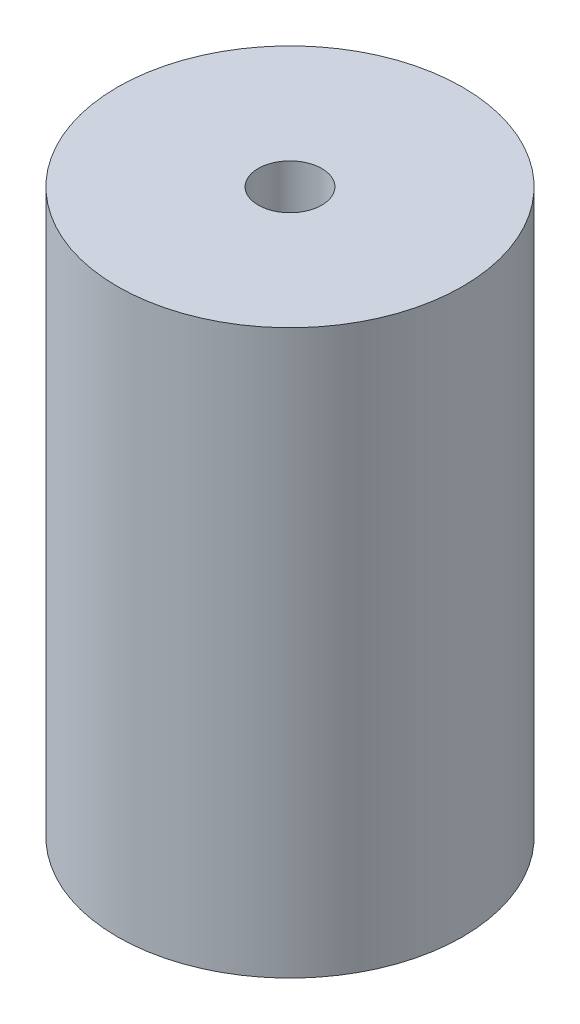
ISO-10303-21;
HEADER;
FILE_DESCRIPTION(('STEP AP214'),'2;1');
FILE_NAME('part.step','',(''),(''),'','','');
FILE_SCHEMA(('AUTOMOTIVE_DESIGN { 1 0 10303 214 1 1 1 1 }'));
ENDSEC;
DATA;
#1=APPLICATION_CONTEXT('core data for automotive mechanical design processes');
#2=APPLICATION_PROTOCOL_DEFINITION('international standard','automotive_design',2000,#1);
#3=PRODUCT_CONTEXT('',#1,'mechanical');
#4=PRODUCT('Part','Part','',(#3));
#5=PRODUCT_RELATED_PRODUCT_CATEGORY('part','',(#4));
#6=PRODUCT_DEFINITION_FORMATION('','',#4);
#7=PRODUCT_DEFINITION_CONTEXT('part definition',#1,'design');
#8=PRODUCT_DEFINITION('design','',#6,#7);
#9=PRODUCT_DEFINITION_SHAPE('','',#8);
#10=(LENGTH_UNIT() NAMED_UNIT(*) SI_UNIT(.MILLI.,.METRE.));
#11=(NAMED_UNIT(*) PLANE_ANGLE_UNIT() SI_UNIT($,.RADIAN.));
#12=(NAMED_UNIT(*) SI_UNIT($,.STERADIAN.) SOLID_ANGLE_UNIT());
#13=UNCERTAINTY_MEASURE_WITH_UNIT(LENGTH_MEASURE(1.E-05),#10,'distance_accuracy_value','');
#14=(GEOMETRIC_REPRESENTATION_CONTEXT(3) GLOBAL_UNCERTAINTY_ASSIGNED_CONTEXT((#13)) GLOBAL_UNIT_ASSIGNED_CONTEXT((#10,
#11,#12)) REPRESENTATION_CONTEXT('',''));
#15=CARTESIAN_POINT('',(0.,0.,0.));
#16=DIRECTION('',(0.,0.,1.));
#17=DIRECTION('',(1.,0.,0.));
#18=AXIS2_PLACEMENT_3D('',#15,#16,#17);
#19=CARTESIAN_POINT('',(0.,62.,0.));
#20=DIRECTION('',(0.,1.,0.));
#21=DIRECTION('',(0.,0.,1.));
#22=AXIS2_PLACEMENT_3D('',#19,#20,#21);
#23=PLANE('',#22);
#24=CARTESIAN_POINT('',(0.,62.,0.));
#25=DIRECTION('',(0.,1.,0.));
#26=DIRECTION('',(0.,0.,1.));
#27=AXIS2_PLACEMENT_3D('',#24,#25,#26);
#28=CIRCLE('',#27,19.);
#29=CARTESIAN_POINT('',(0.,62.,19.));
#30=VERTEX_POINT('',#29);
#31=EDGE_CURVE('E10',#30,#30,#28,.T.);
#32=ORIENTED_EDGE('',*,*,#31,.T.);
#33=EDGE_LOOP('',(#32));
#34=FACE_BOUND('',#33,.T.);
#35=CARTESIAN_POINT('',(0.,62.,0.));
#36=DIRECTION('',(0.,1.,0.));
#37=DIRECTION('',(0.,0.,1.));
#38=AXIS2_PLACEMENT_3D('',#35,#36,#37);
#39=CIRCLE('',#38,3.5);
#40=CARTESIAN_POINT('',(0.,62.,3.5));
#41=VERTEX_POINT('',#40);
#42=EDGE_CURVE('E44',#41,#41,#39,.T.);
#43=ORIENTED_EDGE('',*,*,#42,.F.);
#44=EDGE_LOOP('',(#43));
#45=FACE_BOUND('',#44,.T.);
#46=ADVANCED_FACE('F33',(#34,#45),#23,.T.);
#47=CARTESIAN_POINT('',(0.,0.,0.));
#48=DIRECTION('',(0.,1.,0.));
#49=DIRECTION('',(0.,0.,1.));
#50=AXIS2_PLACEMENT_3D('',#47,#48,#49);
#51=PLANE('',#50);
#52=CARTESIAN_POINT('',(0.,0.,0.));
#53=DIRECTION('',(0.,1.,0.));
#54=DIRECTION('',(0.,0.,1.));
#55=AXIS2_PLACEMENT_3D('',#52,#53,#54);
#56=CIRCLE('',#55,19.);
#57=CARTESIAN_POINT('',(0.,0.,19.));
#58=VERTEX_POINT('',#57);
#59=EDGE_CURVE('E37',#58,#58,#56,.T.);
#60=ORIENTED_EDGE('',*,*,#59,.F.);
#61=EDGE_LOOP('',(#60));
#62=FACE_BOUND('',#61,.T.);
#63=CARTESIAN_POINT('',(0.,0.,0.));
#64=DIRECTION('',(0.,1.,0.));
#65=DIRECTION('',(0.,0.,1.));
#66=AXIS2_PLACEMENT_3D('',#63,#64,#65);
#67=CIRCLE('',#66,3.5);
#68=CARTESIAN_POINT('',(0.,0.,3.5));
#69=VERTEX_POINT('',#68);
#70=EDGE_CURVE('E46',#69,#69,#67,.T.);
#71=ORIENTED_EDGE('',*,*,#70,.T.);
#72=EDGE_LOOP('',(#71));
#73=FACE_BOUND('',#72,.T.);
#74=ADVANCED_FACE('F56',(#62,#73),#51,.F.);
#75=CARTESIAN_POINT('',(0.,62.,0.));
#76=DIRECTION('',(0.,-1.,0.));
#77=DIRECTION('',(0.,0.,-1.));
#78=AXIS2_PLACEMENT_3D('',#75,#76,#77);
#79=CYLINDRICAL_SURFACE('',#78,19.);
#80=ORIENTED_EDGE('',*,*,#31,.F.);
#81=EDGE_LOOP('',(#80));
#82=FACE_BOUND('',#81,.T.);
#83=ORIENTED_EDGE('',*,*,#59,.T.);
#84=EDGE_LOOP('',(#83));
#85=FACE_BOUND('',#84,.T.);
#86=ADVANCED_FACE('F35',(#82,#85),#79,.T.);
#87=CARTESIAN_POINT('',(0.,62.,0.));
#88=DIRECTION('',(0.,-1.,0.));
#89=DIRECTION('',(0.,0.,-1.));
#90=AXIS2_PLACEMENT_3D('',#87,#88,#89);
#91=CYLINDRICAL_SURFACE('',#90,3.5);
#92=ORIENTED_EDGE('',*,*,#42,.T.);
#93=EDGE_LOOP('',(#92));
#94=FACE_BOUND('',#93,.T.);
#95=ORIENTED_EDGE('',*,*,#70,.F.);
#96=EDGE_LOOP('',(#95));
#97=FACE_BOUND('',#96,.T.);
#98=ADVANCED_FACE('F52',(#94,#97),#91,.F.);
#99=CLOSED_SHELL('',(#46,#74,#86,#98));
#100=MANIFOLD_SOLID_BREP('B2',#99);
#101=ADVANCED_BREP_SHAPE_REPRESENTATION('',(#18,#100),#14);
#102=SHAPE_DEFINITION_REPRESENTATION(#9,#101);
ENDSEC;
END-ISO-10303-21;
